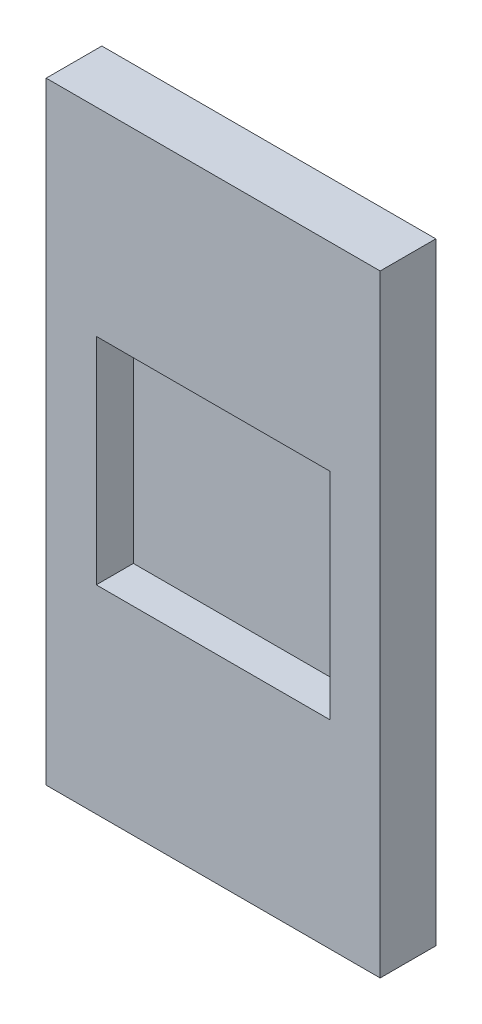
ISO-10303-21;
HEADER;
FILE_DESCRIPTION(('STEP AP214'),'2;1');
FILE_NAME('part.step','',(''),(''),'','','');
FILE_SCHEMA(('AUTOMOTIVE_DESIGN { 1 0 10303 214 1 1 1 1 }'));
ENDSEC;
DATA;
#1=APPLICATION_CONTEXT('core data for automotive mechanical design processes');
#2=APPLICATION_PROTOCOL_DEFINITION('international standard','automotive_design',2000,#1);
#3=PRODUCT_CONTEXT('',#1,'mechanical');
#4=PRODUCT('Part','Part','',(#3));
#5=PRODUCT_RELATED_PRODUCT_CATEGORY('part','',(#4));
#6=PRODUCT_DEFINITION_FORMATION('','',#4);
#7=PRODUCT_DEFINITION_CONTEXT('part definition',#1,'design');
#8=PRODUCT_DEFINITION('design','',#6,#7);
#9=PRODUCT_DEFINITION_SHAPE('','',#8);
#10=(LENGTH_UNIT() NAMED_UNIT(*) SI_UNIT(.MILLI.,.METRE.));
#11=(NAMED_UNIT(*) PLANE_ANGLE_UNIT() SI_UNIT($,.RADIAN.));
#12=(NAMED_UNIT(*) SI_UNIT($,.STERADIAN.) SOLID_ANGLE_UNIT());
#13=UNCERTAINTY_MEASURE_WITH_UNIT(LENGTH_MEASURE(1.E-05),#10,'distance_accuracy_value','');
#14=(GEOMETRIC_REPRESENTATION_CONTEXT(3) GLOBAL_UNCERTAINTY_ASSIGNED_CONTEXT((#13)) GLOBAL_UNIT_ASSIGNED_CONTEXT((#10,
#11,#12)) REPRESENTATION_CONTEXT('',''));
#15=CARTESIAN_POINT('',(0.,0.,0.));
#16=DIRECTION('',(0.,0.,1.));
#17=DIRECTION('',(1.,0.,0.));
#18=AXIS2_PLACEMENT_3D('',#15,#16,#17);
#19=CARTESIAN_POINT('',(9.,-16.5,3.));
#20=DIRECTION('',(-1.,0.,0.));
#21=DIRECTION('',(0.,0.,1.));
#22=AXIS2_PLACEMENT_3D('',#19,#20,#21);
#23=PLANE('',#22);
#24=DIRECTION('',(0.,1.,0.));
#25=VECTOR('',#24,1.);
#26=CARTESIAN_POINT('',(9.,-16.5,0.));
#27=LINE('',#26,#25);
#28=CARTESIAN_POINT('',(9.,-16.5,0.));
#29=VERTEX_POINT('',#28);
#30=CARTESIAN_POINT('',(9.,16.5,0.));
#31=VERTEX_POINT('',#30);
#32=EDGE_CURVE('E145',#29,#31,#27,.T.);
#33=ORIENTED_EDGE('',*,*,#32,.T.);
#34=DIRECTION('',(0.,0.,-1.));
#35=VECTOR('',#34,1.);
#36=CARTESIAN_POINT('',(9.,16.5,3.));
#37=LINE('',#36,#35);
#38=CARTESIAN_POINT('',(9.,16.5,3.));
#39=VERTEX_POINT('',#38);
#40=EDGE_CURVE('E11',#39,#31,#37,.T.);
#41=ORIENTED_EDGE('',*,*,#40,.F.);
#42=DIRECTION('',(0.,1.,0.));
#43=VECTOR('',#42,1.);
#44=CARTESIAN_POINT('',(9.,-16.5,3.));
#45=LINE('',#44,#43);
#46=CARTESIAN_POINT('',(9.,-16.5,3.));
#47=VERTEX_POINT('',#46);
#48=EDGE_CURVE('E149',#47,#39,#45,.T.);
#49=ORIENTED_EDGE('',*,*,#48,.F.);
#50=DIRECTION('',(0.,0.,-1.));
#51=VECTOR('',#50,1.);
#52=CARTESIAN_POINT('',(9.,-16.5,3.));
#53=LINE('',#52,#51);
#54=EDGE_CURVE('E155',#47,#29,#53,.T.);
#55=ORIENTED_EDGE('',*,*,#54,.T.);
#56=EDGE_LOOP('',(#33,#41,#49,#55));
#57=FACE_BOUND('',#56,.T.);
#58=ADVANCED_FACE('F37',(#57),#23,.F.);
#59=CARTESIAN_POINT('',(-9.,16.5,3.));
#60=DIRECTION('',(0.,-1.,0.));
#61=DIRECTION('',(0.,0.,-1.));
#62=AXIS2_PLACEMENT_3D('',#59,#60,#61);
#63=PLANE('',#62);
#64=DIRECTION('',(-1.,0.,0.));
#65=VECTOR('',#64,1.);
#66=CARTESIAN_POINT('',(-9.,16.5,0.));
#67=LINE('',#66,#65);
#68=CARTESIAN_POINT('',(-9.,16.5,0.));
#69=VERTEX_POINT('',#68);
#70=EDGE_CURVE('E158',#31,#69,#67,.T.);
#71=ORIENTED_EDGE('',*,*,#70,.T.);
#72=DIRECTION('',(0.,0.,-1.));
#73=VECTOR('',#72,1.);
#74=CARTESIAN_POINT('',(-9.,16.5,3.));
#75=LINE('',#74,#73);
#76=CARTESIAN_POINT('',(-9.,16.5,3.));
#77=VERTEX_POINT('',#76);
#78=EDGE_CURVE('E44',#77,#69,#75,.T.);
#79=ORIENTED_EDGE('',*,*,#78,.F.);
#80=DIRECTION('',(-1.,0.,0.));
#81=VECTOR('',#80,1.);
#82=CARTESIAN_POINT('',(-9.,16.5,3.));
#83=LINE('',#82,#81);
#84=EDGE_CURVE('E88',#39,#77,#83,.T.);
#85=ORIENTED_EDGE('',*,*,#84,.F.);
#86=ORIENTED_EDGE('',*,*,#40,.T.);
#87=EDGE_LOOP('',(#71,#79,#85,#86));
#88=FACE_BOUND('',#87,.T.);
#89=ADVANCED_FACE('F187',(#88),#63,.F.);
#90=CARTESIAN_POINT('',(-9.,-16.5,3.));
#91=DIRECTION('',(1.,0.,0.));
#92=DIRECTION('',(0.,0.,-1.));
#93=AXIS2_PLACEMENT_3D('',#90,#91,#92);
#94=PLANE('',#93);
#95=DIRECTION('',(0.,-1.,0.));
#96=VECTOR('',#95,1.);
#97=CARTESIAN_POINT('',(-9.,-16.5,0.));
#98=LINE('',#97,#96);
#99=CARTESIAN_POINT('',(-9.,-16.5,0.));
#100=VERTEX_POINT('',#99);
#101=EDGE_CURVE('E160',#69,#100,#98,.T.);
#102=ORIENTED_EDGE('',*,*,#101,.T.);
#103=DIRECTION('',(0.,0.,-1.));
#104=VECTOR('',#103,1.);
#105=CARTESIAN_POINT('',(-9.,-16.5,3.));
#106=LINE('',#105,#104);
#107=CARTESIAN_POINT('',(-9.,-16.5,3.));
#108=VERTEX_POINT('',#107);
#109=EDGE_CURVE('E164',#108,#100,#106,.T.);
#110=ORIENTED_EDGE('',*,*,#109,.F.);
#111=DIRECTION('',(0.,-1.,0.));
#112=VECTOR('',#111,1.);
#113=CARTESIAN_POINT('',(-9.,-16.5,3.));
#114=LINE('',#113,#112);
#115=EDGE_CURVE('E152',#77,#108,#114,.T.);
#116=ORIENTED_EDGE('',*,*,#115,.F.);
#117=ORIENTED_EDGE('',*,*,#78,.T.);
#118=EDGE_LOOP('',(#102,#110,#116,#117));
#119=FACE_BOUND('',#118,.T.);
#120=ADVANCED_FACE('F169',(#119),#94,.F.);
#121=CARTESIAN_POINT('',(-9.,-16.5,3.));
#122=DIRECTION('',(0.,1.,0.));
#123=DIRECTION('',(0.,0.,1.));
#124=AXIS2_PLACEMENT_3D('',#121,#122,#123);
#125=PLANE('',#124);
#126=DIRECTION('',(1.,0.,0.));
#127=VECTOR('',#126,1.);
#128=CARTESIAN_POINT('',(-9.,-16.5,0.));
#129=LINE('',#128,#127);
#130=EDGE_CURVE('E81',#100,#29,#129,.T.);
#131=ORIENTED_EDGE('',*,*,#130,.T.);
#132=ORIENTED_EDGE('',*,*,#54,.F.);
#133=DIRECTION('',(1.,0.,0.));
#134=VECTOR('',#133,1.);
#135=CARTESIAN_POINT('',(-9.,-16.5,3.));
#136=LINE('',#135,#134);
#137=EDGE_CURVE('E60',#108,#47,#136,.T.);
#138=ORIENTED_EDGE('',*,*,#137,.F.);
#139=ORIENTED_EDGE('',*,*,#109,.T.);
#140=EDGE_LOOP('',(#131,#132,#138,#139));
#141=FACE_BOUND('',#140,.T.);
#142=ADVANCED_FACE('F177',(#141),#125,.F.);
#143=CARTESIAN_POINT('',(0.,0.,3.));
#144=DIRECTION('',(0.,0.,-1.));
#145=DIRECTION('',(-1.,0.,0.));
#146=AXIS2_PLACEMENT_3D('',#143,#144,#145);
#147=PLANE('',#146);
#148=DIRECTION('',(-1.,0.,0.));
#149=VECTOR('',#148,1.);
#150=CARTESIAN_POINT('',(-6.3,5.8,3.));
#151=LINE('',#150,#149);
#152=CARTESIAN_POINT('',(6.3,5.8,3.));
#153=VERTEX_POINT('',#152);
#154=CARTESIAN_POINT('',(-6.3,5.8,3.));
#155=VERTEX_POINT('',#154);
#156=EDGE_CURVE('E139',#153,#155,#151,.T.);
#157=ORIENTED_EDGE('',*,*,#156,.F.);
#158=DIRECTION('',(0.,1.,0.));
#159=VECTOR('',#158,1.);
#160=CARTESIAN_POINT('',(6.3,-5.8,3.));
#161=LINE('',#160,#159);
#162=CARTESIAN_POINT('',(6.3,-5.8,3.));
#163=VERTEX_POINT('',#162);
#164=EDGE_CURVE('E51',#163,#153,#161,.T.);
#165=ORIENTED_EDGE('',*,*,#164,.F.);
#166=DIRECTION('',(1.,0.,0.));
#167=VECTOR('',#166,1.);
#168=CARTESIAN_POINT('',(-6.3,-5.8,3.));
#169=LINE('',#168,#167);
#170=CARTESIAN_POINT('',(-6.3,-5.8,3.));
#171=VERTEX_POINT('',#170);
#172=EDGE_CURVE('E130',#171,#163,#169,.T.);
#173=ORIENTED_EDGE('',*,*,#172,.F.);
#174=DIRECTION('',(0.,-1.,0.));
#175=VECTOR('',#174,1.);
#176=CARTESIAN_POINT('',(-6.3,-5.8,3.));
#177=LINE('',#176,#175);
#178=EDGE_CURVE('E133',#155,#171,#177,.T.);
#179=ORIENTED_EDGE('',*,*,#178,.F.);
#180=EDGE_LOOP('',(#157,#165,#173,#179));
#181=FACE_BOUND('',#180,.T.);
#182=ORIENTED_EDGE('',*,*,#48,.T.);
#183=ORIENTED_EDGE('',*,*,#84,.T.);
#184=ORIENTED_EDGE('',*,*,#115,.T.);
#185=ORIENTED_EDGE('',*,*,#137,.T.);
#186=EDGE_LOOP('',(#182,#183,#184,#185));
#187=FACE_BOUND('',#186,.T.);
#188=ADVANCED_FACE('F179',(#181,#187),#147,.F.);
#189=CARTESIAN_POINT('',(0.,0.,0.));
#190=DIRECTION('',(0.,0.,-1.));
#191=DIRECTION('',(-1.,0.,0.));
#192=AXIS2_PLACEMENT_3D('',#189,#190,#191);
#193=PLANE('',#192);
#194=ORIENTED_EDGE('',*,*,#32,.F.);
#195=ORIENTED_EDGE('',*,*,#130,.F.);
#196=ORIENTED_EDGE('',*,*,#101,.F.);
#197=ORIENTED_EDGE('',*,*,#70,.F.);
#198=EDGE_LOOP('',(#194,#195,#196,#197));
#199=FACE_BOUND('',#198,.T.);
#200=ADVANCED_FACE('F173',(#199),#193,.T.);
#201=CARTESIAN_POINT('',(6.3,-5.8,1.));
#202=DIRECTION('',(1.,0.,0.));
#203=DIRECTION('',(0.,0.,-1.));
#204=AXIS2_PLACEMENT_3D('',#201,#202,#203);
#205=PLANE('',#204);
#206=ORIENTED_EDGE('',*,*,#164,.T.);
#207=DIRECTION('',(0.,0.,1.));
#208=VECTOR('',#207,1.);
#209=CARTESIAN_POINT('',(6.3,5.8,1.));
#210=LINE('',#209,#208);
#211=CARTESIAN_POINT('',(6.3,5.8,1.));
#212=VERTEX_POINT('',#211);
#213=EDGE_CURVE('E108',#212,#153,#210,.T.);
#214=ORIENTED_EDGE('',*,*,#213,.F.);
#215=DIRECTION('',(0.,1.,0.));
#216=VECTOR('',#215,1.);
#217=CARTESIAN_POINT('',(6.3,-5.8,1.));
#218=LINE('',#217,#216);
#219=CARTESIAN_POINT('',(6.3,-5.8,1.));
#220=VERTEX_POINT('',#219);
#221=EDGE_CURVE('E112',#220,#212,#218,.T.);
#222=ORIENTED_EDGE('',*,*,#221,.F.);
#223=DIRECTION('',(0.,0.,1.));
#224=VECTOR('',#223,1.);
#225=CARTESIAN_POINT('',(6.3,-5.8,1.));
#226=LINE('',#225,#224);
#227=EDGE_CURVE('E143',#220,#163,#226,.T.);
#228=ORIENTED_EDGE('',*,*,#227,.T.);
#229=EDGE_LOOP('',(#206,#214,#222,#228));
#230=FACE_BOUND('',#229,.T.);
#231=ADVANCED_FACE('F110',(#230),#205,.F.);
#232=CARTESIAN_POINT('',(-6.3,-5.8,1.));
#233=DIRECTION('',(0.,-1.,0.));
#234=DIRECTION('',(0.,0.,-1.));
#235=AXIS2_PLACEMENT_3D('',#232,#233,#234);
#236=PLANE('',#235);
#237=ORIENTED_EDGE('',*,*,#172,.T.);
#238=ORIENTED_EDGE('',*,*,#227,.F.);
#239=DIRECTION('',(1.,0.,0.));
#240=VECTOR('',#239,1.);
#241=CARTESIAN_POINT('',(-6.3,-5.8,1.));
#242=LINE('',#241,#240);
#243=CARTESIAN_POINT('',(-6.3,-5.8,1.));
#244=VERTEX_POINT('',#243);
#245=EDGE_CURVE('E118',#244,#220,#242,.T.);
#246=ORIENTED_EDGE('',*,*,#245,.F.);
#247=DIRECTION('',(0.,0.,1.));
#248=VECTOR('',#247,1.);
#249=CARTESIAN_POINT('',(-6.3,-5.8,1.));
#250=LINE('',#249,#248);
#251=EDGE_CURVE('E146',#244,#171,#250,.T.);
#252=ORIENTED_EDGE('',*,*,#251,.T.);
#253=EDGE_LOOP('',(#237,#238,#246,#252));
#254=FACE_BOUND('',#253,.T.);
#255=ADVANCED_FACE('F226',(#254),#236,.F.);
#256=CARTESIAN_POINT('',(-6.3,-5.8,1.));
#257=DIRECTION('',(-1.,0.,0.));
#258=DIRECTION('',(0.,0.,1.));
#259=AXIS2_PLACEMENT_3D('',#256,#257,#258);
#260=PLANE('',#259);
#261=ORIENTED_EDGE('',*,*,#178,.T.);
#262=ORIENTED_EDGE('',*,*,#251,.F.);
#263=DIRECTION('',(0.,-1.,0.));
#264=VECTOR('',#263,1.);
#265=CARTESIAN_POINT('',(-6.3,-5.8,1.));
#266=LINE('',#265,#264);
#267=CARTESIAN_POINT('',(-6.3,5.8,1.));
#268=VERTEX_POINT('',#267);
#269=EDGE_CURVE('E126',#268,#244,#266,.T.);
#270=ORIENTED_EDGE('',*,*,#269,.F.);
#271=DIRECTION('',(0.,0.,1.));
#272=VECTOR('',#271,1.);
#273=CARTESIAN_POINT('',(-6.3,5.8,1.));
#274=LINE('',#273,#272);
#275=EDGE_CURVE('E117',#268,#155,#274,.T.);
#276=ORIENTED_EDGE('',*,*,#275,.T.);
#277=EDGE_LOOP('',(#261,#262,#270,#276));
#278=FACE_BOUND('',#277,.T.);
#279=ADVANCED_FACE('F235',(#278),#260,.F.);
#280=CARTESIAN_POINT('',(-6.3,5.8,1.));
#281=DIRECTION('',(0.,1.,0.));
#282=DIRECTION('',(0.,0.,1.));
#283=AXIS2_PLACEMENT_3D('',#280,#281,#282);
#284=PLANE('',#283);
#285=ORIENTED_EDGE('',*,*,#156,.T.);
#286=ORIENTED_EDGE('',*,*,#275,.F.);
#287=DIRECTION('',(-1.,0.,0.));
#288=VECTOR('',#287,1.);
#289=CARTESIAN_POINT('',(-6.3,5.8,1.));
#290=LINE('',#289,#288);
#291=EDGE_CURVE('E121',#212,#268,#290,.T.);
#292=ORIENTED_EDGE('',*,*,#291,.F.);
#293=ORIENTED_EDGE('',*,*,#213,.T.);
#294=EDGE_LOOP('',(#285,#286,#292,#293));
#295=FACE_BOUND('',#294,.T.);
#296=ADVANCED_FACE('F122',(#295),#284,.F.);
#297=CARTESIAN_POINT('',(0.,0.,1.));
#298=DIRECTION('',(0.,0.,-1.));
#299=DIRECTION('',(-1.,0.,0.));
#300=AXIS2_PLACEMENT_3D('',#297,#298,#299);
#301=PLANE('',#300);
#302=ORIENTED_EDGE('',*,*,#221,.T.);
#303=ORIENTED_EDGE('',*,*,#291,.T.);
#304=ORIENTED_EDGE('',*,*,#269,.T.);
#305=ORIENTED_EDGE('',*,*,#245,.T.);
#306=EDGE_LOOP('',(#302,#303,#304,#305));
#307=FACE_BOUND('',#306,.T.);
#308=ADVANCED_FACE('F128',(#307),#301,.F.);
#309=CLOSED_SHELL('',(#58,#89,#120,#142,#188,#200,#231,#255,#279,#296,#308));
#310=MANIFOLD_SOLID_BREP('B2',#309);
#311=ADVANCED_BREP_SHAPE_REPRESENTATION('',(#18,#310),#14);
#312=SHAPE_DEFINITION_REPRESENTATION(#9,#311);
ENDSEC;
END-ISO-10303-21;
